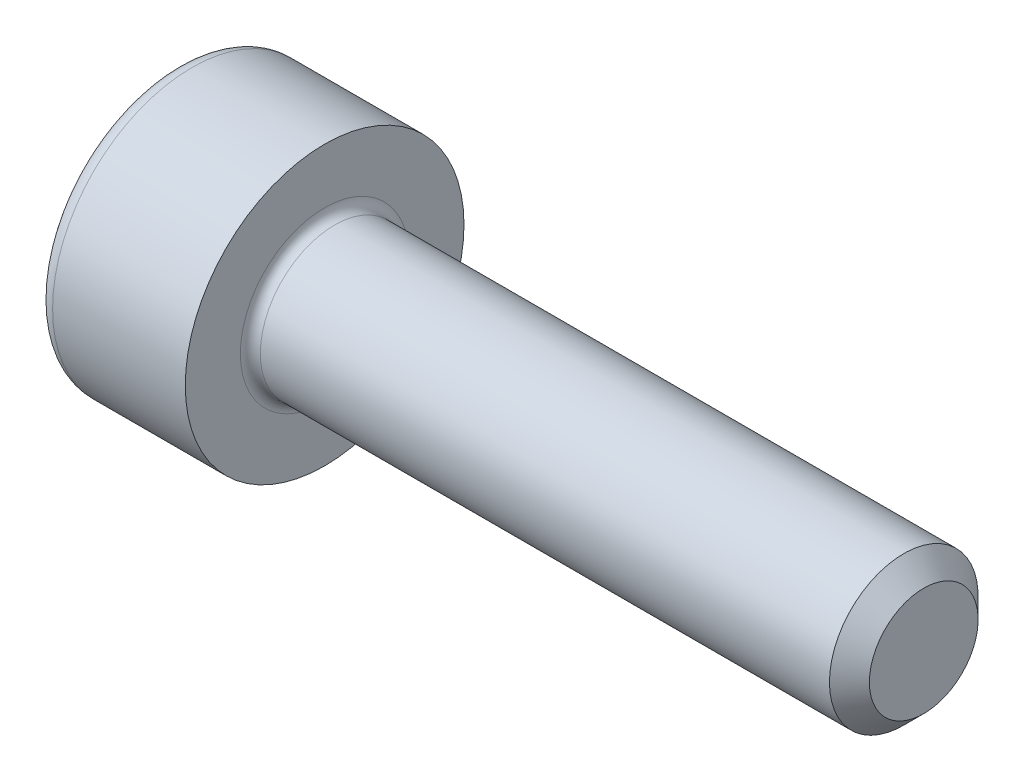
ISO-10303-21;
HEADER;
FILE_DESCRIPTION(('STEP AP214'),'2;1');
FILE_NAME('part.step','',(''),(''),'','','');
FILE_SCHEMA(('AUTOMOTIVE_DESIGN { 1 0 10303 214 1 1 1 1 }'));
ENDSEC;
DATA;
#1=APPLICATION_CONTEXT('core data for automotive mechanical design processes');
#2=APPLICATION_PROTOCOL_DEFINITION('international standard','automotive_design',2000,#1);
#3=PRODUCT_CONTEXT('',#1,'mechanical');
#4=PRODUCT('Part','Part','',(#3));
#5=PRODUCT_RELATED_PRODUCT_CATEGORY('part','',(#4));
#6=PRODUCT_DEFINITION_FORMATION('','',#4);
#7=PRODUCT_DEFINITION_CONTEXT('part definition',#1,'design');
#8=PRODUCT_DEFINITION('design','',#6,#7);
#9=PRODUCT_DEFINITION_SHAPE('','',#8);
#10=(LENGTH_UNIT() NAMED_UNIT(*) SI_UNIT(.MILLI.,.METRE.));
#11=(NAMED_UNIT(*) PLANE_ANGLE_UNIT() SI_UNIT($,.RADIAN.));
#12=(NAMED_UNIT(*) SI_UNIT($,.STERADIAN.) SOLID_ANGLE_UNIT());
#13=UNCERTAINTY_MEASURE_WITH_UNIT(LENGTH_MEASURE(1.E-05),#10,'distance_accuracy_value','');
#14=(GEOMETRIC_REPRESENTATION_CONTEXT(3) GLOBAL_UNCERTAINTY_ASSIGNED_CONTEXT((#13)) GLOBAL_UNIT_ASSIGNED_CONTEXT((#10,
#11,#12)) REPRESENTATION_CONTEXT('',''));
#15=CARTESIAN_POINT('',(0.,0.,0.));
#16=DIRECTION('',(0.,0.,1.));
#17=DIRECTION('',(1.,0.,0.));
#18=AXIS2_PLACEMENT_3D('',#15,#16,#17);
#19=CARTESIAN_POINT('',(0.,0.,0.));
#20=DIRECTION('',(-1.,0.,0.));
#21=DIRECTION('',(0.,0.,1.));
#22=AXIS2_PLACEMENT_3D('',#19,#20,#21);
#23=CYLINDRICAL_SURFACE('',#22,1.39568824458778);
#24=CARTESIAN_POINT('',(0.16,0.,0.));
#25=DIRECTION('',(1.,0.,0.));
#26=DIRECTION('',(0.,0.,-1.));
#27=AXIS2_PLACEMENT_3D('',#24,#25,#26);
#28=CIRCLE('',#27,1.39568824458778);
#29=CARTESIAN_POINT('',(0.16,0.,-1.39568824458778));
#30=VERTEX_POINT('',#29);
#31=EDGE_CURVE('E158',#30,#30,#28,.T.);
#32=ORIENTED_EDGE('',*,*,#31,.T.);
#33=EDGE_LOOP('',(#32));
#34=FACE_BOUND('',#33,.T.);
#35=CARTESIAN_POINT('',(1.48873412756029,0.,0.));
#36=DIRECTION('',(-1.,0.,0.));
#37=DIRECTION('',(0.,0.,1.));
#38=AXIS2_PLACEMENT_3D('',#35,#36,#37);
#39=CIRCLE('',#38,1.39568824458778);
#40=CARTESIAN_POINT('',(1.48873412756029,0.,1.39568824458778));
#41=VERTEX_POINT('',#40);
#42=EDGE_CURVE('E141',#41,#41,#39,.T.);
#43=ORIENTED_EDGE('',*,*,#42,.T.);
#44=EDGE_LOOP('',(#43));
#45=FACE_BOUND('',#44,.T.);
#46=ADVANCED_FACE('F39',(#34,#45),#23,.T.);
#47=CARTESIAN_POINT('',(0.,0.,0.));
#48=DIRECTION('',(1.,0.,0.));
#49=DIRECTION('',(0.,0.,-1.));
#50=AXIS2_PLACEMENT_3D('',#47,#48,#49);
#51=PLANE('',#50);
#52=DIRECTION('',(0.,-0.5,-0.866025403784439));
#53=VECTOR('',#52,1.);
#54=CARTESIAN_POINT('',(0.,0.877572409168232,0.));
#55=LINE('',#54,#53);
#56=CARTESIAN_POINT('',(0.,0.877572409168232,0.));
#57=VERTEX_POINT('',#56);
#58=CARTESIAN_POINT('',(0.,0.438786204584116,-0.760000000000001));
#59=VERTEX_POINT('',#58);
#60=EDGE_CURVE('E128',#57,#59,#55,.T.);
#61=ORIENTED_EDGE('',*,*,#60,.F.);
#62=DIRECTION('',(0.,0.5,-0.866025403784439));
#63=VECTOR('',#62,1.);
#64=CARTESIAN_POINT('',(0.,0.438786204584116,0.76));
#65=LINE('',#64,#63);
#66=CARTESIAN_POINT('',(0.,0.438786204584116,0.76));
#67=VERTEX_POINT('',#66);
#68=EDGE_CURVE('E54',#67,#57,#65,.T.);
#69=ORIENTED_EDGE('',*,*,#68,.F.);
#70=DIRECTION('',(0.,1.,0.));
#71=VECTOR('',#70,1.);
#72=CARTESIAN_POINT('',(0.,-0.438786204584116,0.76));
#73=LINE('',#72,#71);
#74=CARTESIAN_POINT('',(0.,-0.438786204584116,0.76));
#75=VERTEX_POINT('',#74);
#76=EDGE_CURVE('E137',#75,#67,#73,.T.);
#77=ORIENTED_EDGE('',*,*,#76,.F.);
#78=DIRECTION('',(0.,0.5,0.866025403784439));
#79=VECTOR('',#78,1.);
#80=CARTESIAN_POINT('',(0.,-0.877572409168232,0.));
#81=LINE('',#80,#79);
#82=CARTESIAN_POINT('',(0.,-0.877572409168232,0.));
#83=VERTEX_POINT('',#82);
#84=EDGE_CURVE('E135',#83,#75,#81,.T.);
#85=ORIENTED_EDGE('',*,*,#84,.F.);
#86=DIRECTION('',(0.,-0.5,0.866025403784438));
#87=VECTOR('',#86,1.);
#88=CARTESIAN_POINT('',(0.,-0.438786204584116,-0.760000000000001));
#89=LINE('',#88,#87);
#90=CARTESIAN_POINT('',(0.,-0.438786204584116,-0.760000000000001));
#91=VERTEX_POINT('',#90);
#92=EDGE_CURVE('E102',#91,#83,#89,.T.);
#93=ORIENTED_EDGE('',*,*,#92,.F.);
#94=DIRECTION('',(0.,-1.,0.));
#95=VECTOR('',#94,1.);
#96=CARTESIAN_POINT('',(0.,0.438786204584116,-0.760000000000001));
#97=LINE('',#96,#95);
#98=EDGE_CURVE('E131',#59,#91,#97,.T.);
#99=ORIENTED_EDGE('',*,*,#98,.F.);
#100=EDGE_LOOP('',(#61,#69,#77,#85,#93,#99));
#101=FACE_BOUND('',#100,.T.);
#102=CARTESIAN_POINT('',(0.,0.,0.));
#103=DIRECTION('',(1.,0.,0.));
#104=DIRECTION('',(0.,0.,-1.));
#105=AXIS2_PLACEMENT_3D('',#102,#103,#104);
#106=CIRCLE('',#105,1.23568824458778);
#107=CARTESIAN_POINT('',(0.,0.,-1.23568824458778));
#108=VERTEX_POINT('',#107);
#109=EDGE_CURVE('E155',#108,#108,#106,.F.);
#110=ORIENTED_EDGE('',*,*,#109,.T.);
#111=EDGE_LOOP('',(#110));
#112=FACE_BOUND('',#111,.T.);
#113=ADVANCED_FACE('F180',(#101,#112),#51,.F.);
#114=CARTESIAN_POINT('',(7.4887341275603,0.,0.));
#115=DIRECTION('',(-1.,0.,0.));
#116=DIRECTION('',(0.,0.,1.));
#117=AXIS2_PLACEMENT_3D('',#114,#115,#116);
#118=PLANE('',#117);
#119=CARTESIAN_POINT('',(7.4887341275603,0.,0.));
#120=DIRECTION('',(-1.,0.,0.));
#121=DIRECTION('',(0.,0.,1.));
#122=AXIS2_PLACEMENT_3D('',#119,#120,#121);
#123=CIRCLE('',#122,0.544367063780145);
#124=CARTESIAN_POINT('',(7.4887341275603,0.,0.544367063780145));
#125=VERTEX_POINT('',#124);
#126=EDGE_CURVE('E11',#125,#125,#123,.F.);
#127=ORIENTED_EDGE('',*,*,#126,.T.);
#128=EDGE_LOOP('',(#127));
#129=FACE_BOUND('',#128,.T.);
#130=ADVANCED_FACE('F186',(#129),#118,.F.);
#131=CARTESIAN_POINT('',(0.,0.,0.));
#132=DIRECTION('',(-1.,0.,0.));
#133=DIRECTION('',(0.,0.,1.));
#134=AXIS2_PLACEMENT_3D('',#131,#132,#133);
#135=CYLINDRICAL_SURFACE('',#134,0.744367063780146);
#136=CARTESIAN_POINT('',(7.28873412756029,0.,0.));
#137=DIRECTION('',(-1.,0.,0.));
#138=DIRECTION('',(0.,0.,1.));
#139=AXIS2_PLACEMENT_3D('',#136,#137,#138);
#140=CIRCLE('',#139,0.744367063780146);
#141=CARTESIAN_POINT('',(7.28873412756029,0.,0.744367063780146));
#142=VERTEX_POINT('',#141);
#143=EDGE_CURVE('E47',#142,#142,#140,.T.);
#144=ORIENTED_EDGE('',*,*,#143,.T.);
#145=EDGE_LOOP('',(#144));
#146=FACE_BOUND('',#145,.T.);
#147=CARTESIAN_POINT('',(1.58873412756029,0.,0.));
#148=DIRECTION('',(-1.,0.,0.));
#149=DIRECTION('',(0.,0.,1.));
#150=AXIS2_PLACEMENT_3D('',#147,#148,#149);
#151=CIRCLE('',#150,0.744367063780146);
#152=CARTESIAN_POINT('',(1.58873412756029,0.,0.744367063780146));
#153=VERTEX_POINT('',#152);
#154=EDGE_CURVE('E152',#153,#153,#151,.F.);
#155=ORIENTED_EDGE('',*,*,#154,.T.);
#156=EDGE_LOOP('',(#155));
#157=FACE_BOUND('',#156,.T.);
#158=ADVANCED_FACE('F163',(#146,#157),#135,.T.);
#159=CARTESIAN_POINT('',(1.48873412756029,0.,0.));
#160=DIRECTION('',(-1.,0.,0.));
#161=DIRECTION('',(0.,0.,1.));
#162=AXIS2_PLACEMENT_3D('',#159,#160,#161);
#163=PLANE('',#162);
#164=CARTESIAN_POINT('',(1.48873412756029,0.,0.));
#165=DIRECTION('',(-1.,0.,0.));
#166=DIRECTION('',(0.,0.,1.));
#167=AXIS2_PLACEMENT_3D('',#164,#165,#166);
#168=CIRCLE('',#167,0.844367063780146);
#169=CARTESIAN_POINT('',(1.48873412756029,0.,0.844367063780146));
#170=VERTEX_POINT('',#169);
#171=EDGE_CURVE('E149',#170,#170,#168,.T.);
#172=ORIENTED_EDGE('',*,*,#171,.T.);
#173=EDGE_LOOP('',(#172));
#174=FACE_BOUND('',#173,.T.);
#175=ORIENTED_EDGE('',*,*,#42,.F.);
#176=EDGE_LOOP('',(#175));
#177=FACE_BOUND('',#176,.T.);
#178=ADVANCED_FACE('F193',(#174,#177),#163,.F.);
#179=CARTESIAN_POINT('',(1.58873412756029,0.,0.));
#180=DIRECTION('',(-1.,0.,0.));
#181=DIRECTION('',(0.,0.,1.));
#182=AXIS2_PLACEMENT_3D('',#179,#180,#181);
#183=TOROIDAL_SURFACE('',#182,0.844367063780146,0.1);
#184=ORIENTED_EDGE('',*,*,#154,.F.);
#185=EDGE_LOOP('',(#184));
#186=FACE_BOUND('',#185,.T.);
#187=ORIENTED_EDGE('',*,*,#171,.F.);
#188=EDGE_LOOP('',(#187));
#189=FACE_BOUND('',#188,.T.);
#190=ADVANCED_FACE('F176',(#186,#189),#183,.F.);
#191=CARTESIAN_POINT('',(0.16,0.,0.));
#192=DIRECTION('',(1.,0.,0.));
#193=DIRECTION('',(0.,0.,-1.));
#194=AXIS2_PLACEMENT_3D('',#191,#192,#193);
#195=TOROIDAL_SURFACE('',#194,1.23568824458778,0.16);
#196=ORIENTED_EDGE('',*,*,#31,.F.);
#197=EDGE_LOOP('',(#196));
#198=FACE_BOUND('',#197,.T.);
#199=ORIENTED_EDGE('',*,*,#109,.F.);
#200=EDGE_LOOP('',(#199));
#201=FACE_BOUND('',#200,.T.);
#202=ADVANCED_FACE('F168',(#198,#201),#195,.T.);
#203=CARTESIAN_POINT('',(7.28873412756029,0.,0.));
#204=DIRECTION('',(-1.,0.,0.));
#205=DIRECTION('',(0.,0.,1.));
#206=AXIS2_PLACEMENT_3D('',#203,#204,#205);
#207=CONICAL_SURFACE('',#206,0.744367063780146,0.785398163397449);
#208=ORIENTED_EDGE('',*,*,#126,.F.);
#209=EDGE_LOOP('',(#208));
#210=FACE_BOUND('',#209,.T.);
#211=ORIENTED_EDGE('',*,*,#143,.F.);
#212=EDGE_LOOP('',(#211));
#213=FACE_BOUND('',#212,.T.);
#214=ADVANCED_FACE('F41',(#210,#213),#207,.T.);
#215=CARTESIAN_POINT('',(0.7,0.438786204584116,0.76));
#216=DIRECTION('',(0.,0.866025403784439,0.5));
#217=DIRECTION('',(0.,-0.5,0.866025403784439));
#218=AXIS2_PLACEMENT_3D('',#215,#216,#217);
#219=PLANE('',#218);
#220=ORIENTED_EDGE('',*,*,#68,.T.);
#221=DIRECTION('',(-1.,0.,0.));
#222=VECTOR('',#221,1.);
#223=CARTESIAN_POINT('',(0.7,0.877572409168232,0.));
#224=LINE('',#223,#222);
#225=CARTESIAN_POINT('',(0.7,0.877572409168232,0.));
#226=VERTEX_POINT('',#225);
#227=EDGE_CURVE('E84',#226,#57,#224,.T.);
#228=ORIENTED_EDGE('',*,*,#227,.F.);
#229=DIRECTION('',(0.,0.5,-0.866025403784439));
#230=VECTOR('',#229,1.);
#231=CARTESIAN_POINT('',(0.7,0.438786204584116,0.76));
#232=LINE('',#231,#230);
#233=CARTESIAN_POINT('',(0.7,0.438786204584116,0.76));
#234=VERTEX_POINT('',#233);
#235=EDGE_CURVE('E139',#234,#226,#232,.T.);
#236=ORIENTED_EDGE('',*,*,#235,.F.);
#237=DIRECTION('',(-1.,0.,0.));
#238=VECTOR('',#237,1.);
#239=CARTESIAN_POINT('',(0.7,0.438786204584116,0.76));
#240=LINE('',#239,#238);
#241=EDGE_CURVE('E62',#234,#67,#240,.T.);
#242=ORIENTED_EDGE('',*,*,#241,.T.);
#243=EDGE_LOOP('',(#220,#228,#236,#242));
#244=FACE_BOUND('',#243,.T.);
#245=ADVANCED_FACE('F167',(#244),#219,.F.);
#246=CARTESIAN_POINT('',(0.7,-0.438786204584116,0.76));
#247=DIRECTION('',(0.,0.,1.));
#248=DIRECTION('',(1.,0.,0.));
#249=AXIS2_PLACEMENT_3D('',#246,#247,#248);
#250=PLANE('',#249);
#251=ORIENTED_EDGE('',*,*,#76,.T.);
#252=ORIENTED_EDGE('',*,*,#241,.F.);
#253=DIRECTION('',(0.,1.,0.));
#254=VECTOR('',#253,1.);
#255=CARTESIAN_POINT('',(0.7,-0.438786204584116,0.76));
#256=LINE('',#255,#254);
#257=CARTESIAN_POINT('',(0.7,-0.438786204584116,0.76));
#258=VERTEX_POINT('',#257);
#259=EDGE_CURVE('E114',#258,#234,#256,.T.);
#260=ORIENTED_EDGE('',*,*,#259,.F.);
#261=DIRECTION('',(-1.,0.,0.));
#262=VECTOR('',#261,1.);
#263=CARTESIAN_POINT('',(0.7,-0.438786204584116,0.76));
#264=LINE('',#263,#262);
#265=EDGE_CURVE('E106',#258,#75,#264,.T.);
#266=ORIENTED_EDGE('',*,*,#265,.T.);
#267=EDGE_LOOP('',(#251,#252,#260,#266));
#268=FACE_BOUND('',#267,.T.);
#269=ADVANCED_FACE('F174',(#268),#250,.F.);
#270=CARTESIAN_POINT('',(0.7,-0.877572409168232,0.));
#271=DIRECTION('',(0.,-0.866025403784439,0.5));
#272=DIRECTION('',(0.,-0.5,-0.866025403784439));
#273=AXIS2_PLACEMENT_3D('',#270,#271,#272);
#274=PLANE('',#273);
#275=ORIENTED_EDGE('',*,*,#84,.T.);
#276=ORIENTED_EDGE('',*,*,#265,.F.);
#277=DIRECTION('',(0.,0.5,0.866025403784439));
#278=VECTOR('',#277,1.);
#279=CARTESIAN_POINT('',(0.7,-0.877572409168232,0.));
#280=LINE('',#279,#278);
#281=CARTESIAN_POINT('',(0.7,-0.877572409168232,0.));
#282=VERTEX_POINT('',#281);
#283=EDGE_CURVE('E110',#282,#258,#280,.T.);
#284=ORIENTED_EDGE('',*,*,#283,.F.);
#285=DIRECTION('',(-1.,0.,0.));
#286=VECTOR('',#285,1.);
#287=CARTESIAN_POINT('',(0.7,-0.877572409168232,0.));
#288=LINE('',#287,#286);
#289=EDGE_CURVE('E95',#282,#83,#288,.T.);
#290=ORIENTED_EDGE('',*,*,#289,.T.);
#291=EDGE_LOOP('',(#275,#276,#284,#290));
#292=FACE_BOUND('',#291,.T.);
#293=ADVANCED_FACE('F111',(#292),#274,.F.);
#294=CARTESIAN_POINT('',(0.7,-0.438786204584116,-0.760000000000001));
#295=DIRECTION('',(0.,-0.866025403784438,-0.5));
#296=DIRECTION('',(0.,0.5,-0.866025403784438));
#297=AXIS2_PLACEMENT_3D('',#294,#295,#296);
#298=PLANE('',#297);
#299=ORIENTED_EDGE('',*,*,#92,.T.);
#300=ORIENTED_EDGE('',*,*,#289,.F.);
#301=DIRECTION('',(0.,-0.5,0.866025403784438));
#302=VECTOR('',#301,1.);
#303=CARTESIAN_POINT('',(0.7,-0.438786204584116,-0.760000000000001));
#304=LINE('',#303,#302);
#305=CARTESIAN_POINT('',(0.7,-0.438786204584116,-0.760000000000001));
#306=VERTEX_POINT('',#305);
#307=EDGE_CURVE('E99',#306,#282,#304,.T.);
#308=ORIENTED_EDGE('',*,*,#307,.F.);
#309=DIRECTION('',(-1.,0.,0.));
#310=VECTOR('',#309,1.);
#311=CARTESIAN_POINT('',(0.7,-0.438786204584116,-0.760000000000001));
#312=LINE('',#311,#310);
#313=EDGE_CURVE('E107',#306,#91,#312,.T.);
#314=ORIENTED_EDGE('',*,*,#313,.T.);
#315=EDGE_LOOP('',(#299,#300,#308,#314));
#316=FACE_BOUND('',#315,.T.);
#317=ADVANCED_FACE('F97',(#316),#298,.F.);
#318=CARTESIAN_POINT('',(0.7,0.438786204584116,-0.760000000000001));
#319=DIRECTION('',(0.,0.,-1.));
#320=DIRECTION('',(0.,1.,0.));
#321=AXIS2_PLACEMENT_3D('',#318,#319,#320);
#322=PLANE('',#321);
#323=ORIENTED_EDGE('',*,*,#98,.T.);
#324=ORIENTED_EDGE('',*,*,#313,.F.);
#325=DIRECTION('',(0.,-1.,0.));
#326=VECTOR('',#325,1.);
#327=CARTESIAN_POINT('',(0.7,0.438786204584116,-0.760000000000001));
#328=LINE('',#327,#326);
#329=CARTESIAN_POINT('',(0.7,0.438786204584116,-0.760000000000001));
#330=VERTEX_POINT('',#329);
#331=EDGE_CURVE('E120',#330,#306,#328,.T.);
#332=ORIENTED_EDGE('',*,*,#331,.F.);
#333=DIRECTION('',(-1.,0.,0.));
#334=VECTOR('',#333,1.);
#335=CARTESIAN_POINT('',(0.7,0.438786204584116,-0.760000000000001));
#336=LINE('',#335,#334);
#337=EDGE_CURVE('E144',#330,#59,#336,.T.);
#338=ORIENTED_EDGE('',*,*,#337,.T.);
#339=EDGE_LOOP('',(#323,#324,#332,#338));
#340=FACE_BOUND('',#339,.T.);
#341=ADVANCED_FACE('F215',(#340),#322,.F.);
#342=CARTESIAN_POINT('',(0.7,0.877572409168232,0.));
#343=DIRECTION('',(0.,0.866025403784439,-0.5));
#344=DIRECTION('',(0.,0.5,0.866025403784439));
#345=AXIS2_PLACEMENT_3D('',#342,#343,#344);
#346=PLANE('',#345);
#347=ORIENTED_EDGE('',*,*,#60,.T.);
#348=ORIENTED_EDGE('',*,*,#337,.F.);
#349=DIRECTION('',(0.,-0.5,-0.866025403784439));
#350=VECTOR('',#349,1.);
#351=CARTESIAN_POINT('',(0.7,0.877572409168232,0.));
#352=LINE('',#351,#350);
#353=EDGE_CURVE('E122',#226,#330,#352,.T.);
#354=ORIENTED_EDGE('',*,*,#353,.F.);
#355=ORIENTED_EDGE('',*,*,#227,.T.);
#356=EDGE_LOOP('',(#347,#348,#354,#355));
#357=FACE_BOUND('',#356,.T.);
#358=ADVANCED_FACE('F212',(#357),#346,.F.);
#359=CARTESIAN_POINT('',(0.7,0.,0.));
#360=DIRECTION('',(-1.,0.,0.));
#361=DIRECTION('',(0.,0.,1.));
#362=AXIS2_PLACEMENT_3D('',#359,#360,#361);
#363=PLANE('',#362);
#364=ORIENTED_EDGE('',*,*,#235,.T.);
#365=ORIENTED_EDGE('',*,*,#353,.T.);
#366=ORIENTED_EDGE('',*,*,#331,.T.);
#367=ORIENTED_EDGE('',*,*,#307,.T.);
#368=ORIENTED_EDGE('',*,*,#283,.T.);
#369=ORIENTED_EDGE('',*,*,#259,.T.);
#370=EDGE_LOOP('',(#364,#365,#366,#367,#368,#369));
#371=FACE_BOUND('',#370,.T.);
#372=ADVANCED_FACE('F117',(#371),#363,.T.);
#373=CLOSED_SHELL('',(#46,#113,#130,#158,#178,#190,#202,#214,#245,#269,#293,#317,#341,#358,#372));
#374=MANIFOLD_SOLID_BREP('B2',#373);
#375=ADVANCED_BREP_SHAPE_REPRESENTATION('',(#18,#374),#14);
#376=SHAPE_DEFINITION_REPRESENTATION(#9,#375);
ENDSEC;
END-ISO-10303-21;
